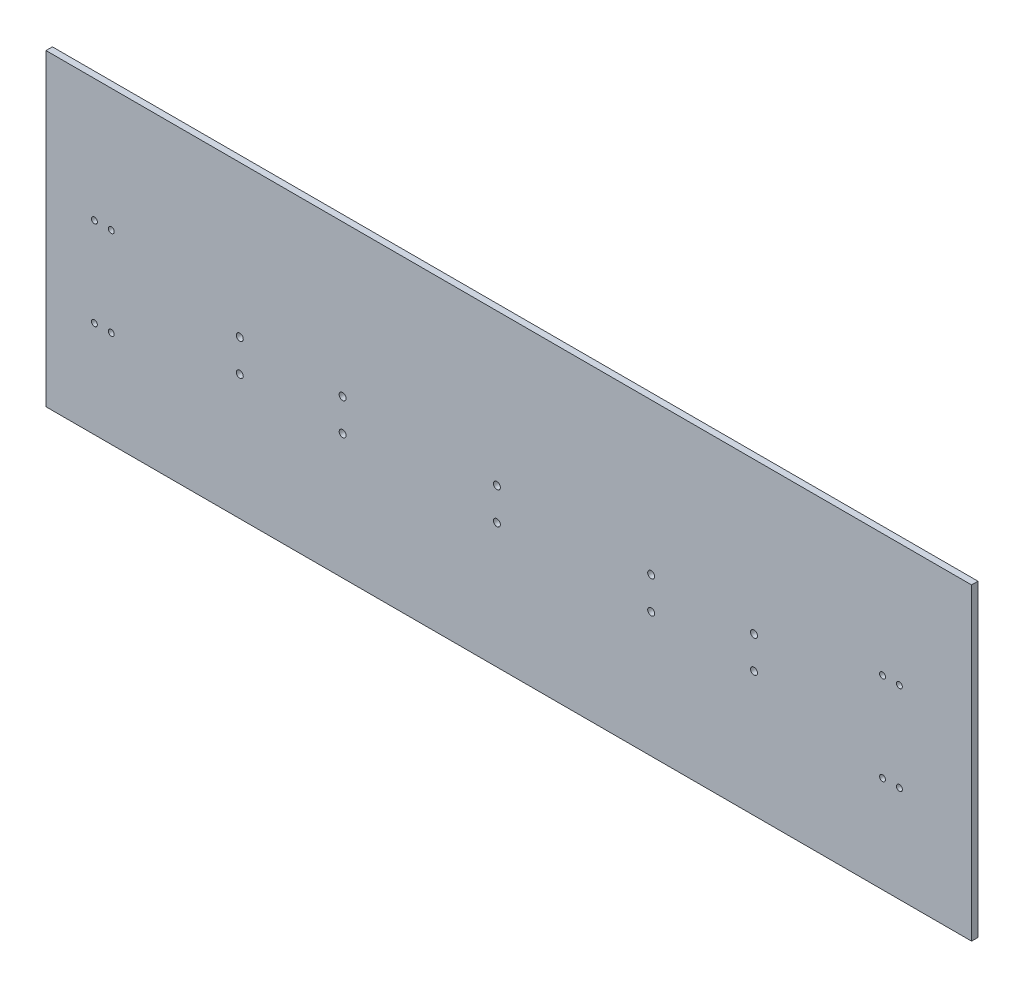
ISO-10303-21;
HEADER;
FILE_DESCRIPTION(('STEP AP214'),'2;1');
FILE_NAME('part.step','',(''),(''),'','','');
FILE_SCHEMA(('AUTOMOTIVE_DESIGN { 1 0 10303 214 1 1 1 1 }'));
ENDSEC;
DATA;
#1=APPLICATION_CONTEXT('core data for automotive mechanical design processes');
#2=APPLICATION_PROTOCOL_DEFINITION('international standard','automotive_design',2000,#1);
#3=PRODUCT_CONTEXT('',#1,'mechanical');
#4=PRODUCT('Part','Part','',(#3));
#5=PRODUCT_RELATED_PRODUCT_CATEGORY('part','',(#4));
#6=PRODUCT_DEFINITION_FORMATION('','',#4);
#7=PRODUCT_DEFINITION_CONTEXT('part definition',#1,'design');
#8=PRODUCT_DEFINITION('design','',#6,#7);
#9=PRODUCT_DEFINITION_SHAPE('','',#8);
#10=(LENGTH_UNIT() NAMED_UNIT(*) SI_UNIT(.MILLI.,.METRE.));
#11=(NAMED_UNIT(*) PLANE_ANGLE_UNIT() SI_UNIT($,.RADIAN.));
#12=(NAMED_UNIT(*) SI_UNIT($,.STERADIAN.) SOLID_ANGLE_UNIT());
#13=UNCERTAINTY_MEASURE_WITH_UNIT(LENGTH_MEASURE(1.E-05),#10,'distance_accuracy_value','');
#14=(GEOMETRIC_REPRESENTATION_CONTEXT(3) GLOBAL_UNCERTAINTY_ASSIGNED_CONTEXT((#13)) GLOBAL_UNIT_ASSIGNED_CONTEXT((#10,
#11,#12)) REPRESENTATION_CONTEXT('',''));
#15=CARTESIAN_POINT('',(0.,0.,0.));
#16=DIRECTION('',(0.,0.,1.));
#17=DIRECTION('',(1.,0.,0.));
#18=AXIS2_PLACEMENT_3D('',#15,#16,#17);
#19=CARTESIAN_POINT('',(0.,0.,6.35));
#20=DIRECTION('',(0.,0.,-1.));
#21=DIRECTION('',(-1.,0.,0.));
#22=AXIS2_PLACEMENT_3D('',#19,#20,#21);
#23=PLANE('',#22);
#24=DIRECTION('',(0.,-1.,0.));
#25=VECTOR('',#24,1.);
#26=CARTESIAN_POINT('',(0.,0.,6.35));
#27=LINE('',#26,#25);
#28=CARTESIAN_POINT('',(0.,304.8,6.35));
#29=VERTEX_POINT('',#28);
#30=CARTESIAN_POINT('',(0.,0.,6.35));
#31=VERTEX_POINT('',#30);
#32=EDGE_CURVE('E85',#29,#31,#27,.T.);
#33=ORIENTED_EDGE('',*,*,#32,.T.);
#34=DIRECTION('',(1.,0.,0.));
#35=VECTOR('',#34,1.);
#36=CARTESIAN_POINT('',(0.,0.,6.35));
#37=LINE('',#36,#35);
#38=CARTESIAN_POINT('',(914.4,0.,6.35));
#39=VERTEX_POINT('',#38);
#40=EDGE_CURVE('E80',#31,#39,#37,.T.);
#41=ORIENTED_EDGE('',*,*,#40,.T.);
#42=DIRECTION('',(0.,1.,0.));
#43=VECTOR('',#42,1.);
#44=CARTESIAN_POINT('',(914.4,0.,6.35));
#45=LINE('',#44,#43);
#46=CARTESIAN_POINT('',(914.4,304.8,6.35));
#47=VERTEX_POINT('',#46);
#48=EDGE_CURVE('E83',#39,#47,#45,.T.);
#49=ORIENTED_EDGE('',*,*,#48,.T.);
#50=DIRECTION('',(-1.,0.,0.));
#51=VECTOR('',#50,1.);
#52=CARTESIAN_POINT('',(0.,304.8,6.35));
#53=LINE('',#52,#51);
#54=EDGE_CURVE('E50',#47,#29,#53,.T.);
#55=ORIENTED_EDGE('',*,*,#54,.T.);
#56=EDGE_LOOP('',(#33,#41,#49,#55));
#57=FACE_BOUND('',#56,.T.);
#58=CARTESIAN_POINT('',(445.45395588462,155.343145214781,6.35));
#59=DIRECTION('',(0.,0.,1.));
#60=DIRECTION('',(1.,0.,0.));
#61=AXIS2_PLACEMENT_3D('',#58,#59,#60);
#62=CIRCLE('',#61,3.429);
#63=CARTESIAN_POINT('',(448.88295588462,155.343145214781,6.35));
#64=VERTEX_POINT('',#63);
#65=EDGE_CURVE('E100',#64,#64,#62,.T.);
#66=ORIENTED_EDGE('',*,*,#65,.F.);
#67=EDGE_LOOP('',(#66));
#68=FACE_BOUND('',#67,.T.);
#69=CARTESIAN_POINT('',(445.45395588462,123.593145214781,6.35));
#70=DIRECTION('',(0.,0.,1.));
#71=DIRECTION('',(1.,0.,0.));
#72=AXIS2_PLACEMENT_3D('',#69,#70,#71);
#73=CIRCLE('',#72,3.429);
#74=CARTESIAN_POINT('',(448.88295588462,123.593145214781,6.35));
#75=VERTEX_POINT('',#74);
#76=EDGE_CURVE('E115',#75,#75,#73,.T.);
#77=ORIENTED_EDGE('',*,*,#76,.F.);
#78=EDGE_LOOP('',(#77));
#79=FACE_BOUND('',#78,.T.);
#80=CARTESIAN_POINT('',(597.85395588462,155.343145214781,6.35));
#81=DIRECTION('',(0.,0.,1.));
#82=DIRECTION('',(1.,0.,0.));
#83=AXIS2_PLACEMENT_3D('',#80,#81,#82);
#84=CIRCLE('',#83,3.429);
#85=CARTESIAN_POINT('',(601.28295588462,155.343145214781,6.35));
#86=VERTEX_POINT('',#85);
#87=EDGE_CURVE('E121',#86,#86,#84,.T.);
#88=ORIENTED_EDGE('',*,*,#87,.F.);
#89=EDGE_LOOP('',(#88));
#90=FACE_BOUND('',#89,.T.);
#91=CARTESIAN_POINT('',(597.85395588462,123.593145214781,6.35));
#92=DIRECTION('',(0.,0.,1.));
#93=DIRECTION('',(1.,0.,0.));
#94=AXIS2_PLACEMENT_3D('',#91,#92,#93);
#95=CIRCLE('',#94,3.429);
#96=CARTESIAN_POINT('',(601.28295588462,123.593145214781,6.35));
#97=VERTEX_POINT('',#96);
#98=EDGE_CURVE('E127',#97,#97,#95,.T.);
#99=ORIENTED_EDGE('',*,*,#98,.F.);
#100=EDGE_LOOP('',(#99));
#101=FACE_BOUND('',#100,.T.);
#102=CARTESIAN_POINT('',(699.45395588462,155.343145214781,6.35));
#103=DIRECTION('',(0.,0.,1.));
#104=DIRECTION('',(1.,0.,0.));
#105=AXIS2_PLACEMENT_3D('',#102,#103,#104);
#106=CIRCLE('',#105,3.429);
#107=CARTESIAN_POINT('',(702.88295588462,155.343145214781,6.35));
#108=VERTEX_POINT('',#107);
#109=EDGE_CURVE('E133',#108,#108,#106,.T.);
#110=ORIENTED_EDGE('',*,*,#109,.F.);
#111=EDGE_LOOP('',(#110));
#112=FACE_BOUND('',#111,.T.);
#113=CARTESIAN_POINT('',(699.45395588462,123.593145214781,6.35));
#114=DIRECTION('',(0.,0.,1.));
#115=DIRECTION('',(1.,0.,0.));
#116=AXIS2_PLACEMENT_3D('',#113,#114,#115);
#117=CIRCLE('',#116,3.429);
#118=CARTESIAN_POINT('',(702.88295588462,123.593145214781,6.35));
#119=VERTEX_POINT('',#118);
#120=EDGE_CURVE('E139',#119,#119,#117,.T.);
#121=ORIENTED_EDGE('',*,*,#120,.F.);
#122=EDGE_LOOP('',(#121));
#123=FACE_BOUND('',#122,.T.);
#124=CARTESIAN_POINT('',(293.05395588462,155.343145214781,6.35));
#125=DIRECTION('',(0.,0.,1.));
#126=DIRECTION('',(1.,0.,0.));
#127=AXIS2_PLACEMENT_3D('',#124,#125,#126);
#128=CIRCLE('',#127,3.429);
#129=CARTESIAN_POINT('',(296.48295588462,155.343145214781,6.35));
#130=VERTEX_POINT('',#129);
#131=EDGE_CURVE('E145',#130,#130,#128,.T.);
#132=ORIENTED_EDGE('',*,*,#131,.F.);
#133=EDGE_LOOP('',(#132));
#134=FACE_BOUND('',#133,.T.);
#135=CARTESIAN_POINT('',(293.05395588462,123.593145214781,6.35));
#136=DIRECTION('',(0.,0.,1.));
#137=DIRECTION('',(1.,0.,0.));
#138=AXIS2_PLACEMENT_3D('',#135,#136,#137);
#139=CIRCLE('',#138,3.429);
#140=CARTESIAN_POINT('',(296.48295588462,123.593145214781,6.35));
#141=VERTEX_POINT('',#140);
#142=EDGE_CURVE('E151',#141,#141,#139,.T.);
#143=ORIENTED_EDGE('',*,*,#142,.F.);
#144=EDGE_LOOP('',(#143));
#145=FACE_BOUND('',#144,.T.);
#146=CARTESIAN_POINT('',(191.45395588462,155.343145214781,6.35));
#147=DIRECTION('',(0.,0.,1.));
#148=DIRECTION('',(1.,0.,0.));
#149=AXIS2_PLACEMENT_3D('',#146,#147,#148);
#150=CIRCLE('',#149,3.42900000000002);
#151=CARTESIAN_POINT('',(194.88295588462,155.343145214781,6.35));
#152=VERTEX_POINT('',#151);
#153=EDGE_CURVE('E157',#152,#152,#150,.T.);
#154=ORIENTED_EDGE('',*,*,#153,.F.);
#155=EDGE_LOOP('',(#154));
#156=FACE_BOUND('',#155,.T.);
#157=CARTESIAN_POINT('',(191.45395588462,123.593145214781,6.35));
#158=DIRECTION('',(0.,0.,1.));
#159=DIRECTION('',(1.,0.,0.));
#160=AXIS2_PLACEMENT_3D('',#157,#158,#159);
#161=CIRCLE('',#160,3.42900000000003);
#162=CARTESIAN_POINT('',(194.88295588462,123.593145214781,6.35));
#163=VERTEX_POINT('',#162);
#164=EDGE_CURVE('E163',#163,#163,#161,.T.);
#165=ORIENTED_EDGE('',*,*,#164,.F.);
#166=EDGE_LOOP('',(#165));
#167=FACE_BOUND('',#166,.T.);
#168=CARTESIAN_POINT('',(47.8169558846197,183.410145214781,6.35));
#169=DIRECTION('',(0.,0.,1.));
#170=DIRECTION('',(1.,0.,0.));
#171=AXIS2_PLACEMENT_3D('',#168,#169,#170);
#172=CIRCLE('',#171,2.921);
#173=CARTESIAN_POINT('',(50.7379558846197,183.410145214781,6.35));
#174=VERTEX_POINT('',#173);
#175=EDGE_CURVE('E169',#174,#174,#172,.T.);
#176=ORIENTED_EDGE('',*,*,#175,.F.);
#177=EDGE_LOOP('',(#176));
#178=FACE_BOUND('',#177,.T.);
#179=CARTESIAN_POINT('',(64.4539558846196,183.410145214781,6.35));
#180=DIRECTION('',(0.,0.,1.));
#181=DIRECTION('',(1.,0.,0.));
#182=AXIS2_PLACEMENT_3D('',#179,#180,#181);
#183=CIRCLE('',#182,2.92100000000001);
#184=CARTESIAN_POINT('',(67.3749558846197,183.410145214781,6.35));
#185=VERTEX_POINT('',#184);
#186=EDGE_CURVE('E175',#185,#185,#183,.T.);
#187=ORIENTED_EDGE('',*,*,#186,.F.);
#188=EDGE_LOOP('',(#187));
#189=FACE_BOUND('',#188,.T.);
#190=CARTESIAN_POINT('',(47.8169558846197,95.5261452147809,6.35));
#191=DIRECTION('',(0.,0.,1.));
#192=DIRECTION('',(1.,0.,0.));
#193=AXIS2_PLACEMENT_3D('',#190,#191,#192);
#194=CIRCLE('',#193,2.921);
#195=CARTESIAN_POINT('',(50.7379558846197,95.5261452147809,6.35));
#196=VERTEX_POINT('',#195);
#197=EDGE_CURVE('E181',#196,#196,#194,.T.);
#198=ORIENTED_EDGE('',*,*,#197,.F.);
#199=EDGE_LOOP('',(#198));
#200=FACE_BOUND('',#199,.T.);
#201=CARTESIAN_POINT('',(64.4539558846197,95.526145214781,6.35));
#202=DIRECTION('',(0.,0.,1.));
#203=DIRECTION('',(1.,0.,0.));
#204=AXIS2_PLACEMENT_3D('',#201,#202,#203);
#205=CIRCLE('',#204,2.92100000000001);
#206=CARTESIAN_POINT('',(67.3749558846197,95.526145214781,6.35));
#207=VERTEX_POINT('',#206);
#208=EDGE_CURVE('E187',#207,#207,#205,.T.);
#209=ORIENTED_EDGE('',*,*,#208,.F.);
#210=EDGE_LOOP('',(#209));
#211=FACE_BOUND('',#210,.T.);
#212=CARTESIAN_POINT('',(826.45395588462,183.410145214781,6.35));
#213=DIRECTION('',(0.,0.,1.));
#214=DIRECTION('',(1.,0.,0.));
#215=AXIS2_PLACEMENT_3D('',#212,#213,#214);
#216=CIRCLE('',#215,2.92099999999994);
#217=CARTESIAN_POINT('',(829.37495588462,183.410145214781,6.35));
#218=VERTEX_POINT('',#217);
#219=EDGE_CURVE('E193',#218,#218,#216,.T.);
#220=ORIENTED_EDGE('',*,*,#219,.F.);
#221=EDGE_LOOP('',(#220));
#222=FACE_BOUND('',#221,.T.);
#223=CARTESIAN_POINT('',(843.09095588462,183.410145214781,6.35));
#224=DIRECTION('',(0.,0.,1.));
#225=DIRECTION('',(1.,0.,0.));
#226=AXIS2_PLACEMENT_3D('',#223,#224,#225);
#227=CIRCLE('',#226,2.92099999999994);
#228=CARTESIAN_POINT('',(846.01195588462,183.410145214781,6.35));
#229=VERTEX_POINT('',#228);
#230=EDGE_CURVE('E199',#229,#229,#227,.T.);
#231=ORIENTED_EDGE('',*,*,#230,.F.);
#232=EDGE_LOOP('',(#231));
#233=FACE_BOUND('',#232,.T.);
#234=CARTESIAN_POINT('',(826.45395588462,95.526145214781,6.35));
#235=DIRECTION('',(0.,0.,1.));
#236=DIRECTION('',(1.,0.,0.));
#237=AXIS2_PLACEMENT_3D('',#234,#235,#236);
#238=CIRCLE('',#237,2.92099999999994);
#239=CARTESIAN_POINT('',(829.37495588462,95.526145214781,6.35));
#240=VERTEX_POINT('',#239);
#241=EDGE_CURVE('E205',#240,#240,#238,.T.);
#242=ORIENTED_EDGE('',*,*,#241,.F.);
#243=EDGE_LOOP('',(#242));
#244=FACE_BOUND('',#243,.T.);
#245=CARTESIAN_POINT('',(843.09095588462,95.526145214781,6.35));
#246=DIRECTION('',(0.,0.,1.));
#247=DIRECTION('',(1.,0.,0.));
#248=AXIS2_PLACEMENT_3D('',#245,#246,#247);
#249=CIRCLE('',#248,2.92099999999994);
#250=CARTESIAN_POINT('',(846.01195588462,95.526145214781,6.35));
#251=VERTEX_POINT('',#250);
#252=EDGE_CURVE('E211',#251,#251,#249,.T.);
#253=ORIENTED_EDGE('',*,*,#252,.F.);
#254=EDGE_LOOP('',(#253));
#255=FACE_BOUND('',#254,.T.);
#256=ADVANCED_FACE('F33',(#57,#68,#79,#90,#101,#112,#123,#134,#145,#156,#167,#178,#189,#200,
#211,#222,#233,#244,#255),#23,.F.);
#257=CARTESIAN_POINT('',(0.,0.,0.));
#258=DIRECTION('',(0.,0.,-1.));
#259=DIRECTION('',(-1.,0.,0.));
#260=AXIS2_PLACEMENT_3D('',#257,#258,#259);
#261=PLANE('',#260);
#262=CARTESIAN_POINT('',(826.45395588462,95.526145214781,0.));
#263=DIRECTION('',(0.,0.,1.));
#264=DIRECTION('',(1.,0.,0.));
#265=AXIS2_PLACEMENT_3D('',#262,#263,#264);
#266=CIRCLE('',#265,2.92099999999994);
#267=CARTESIAN_POINT('',(829.37495588462,95.526145214781,0.));
#268=VERTEX_POINT('',#267);
#269=EDGE_CURVE('E208',#268,#268,#266,.T.);
#270=ORIENTED_EDGE('',*,*,#269,.T.);
#271=EDGE_LOOP('',(#270));
#272=FACE_BOUND('',#271,.T.);
#273=CARTESIAN_POINT('',(826.45395588462,183.410145214781,0.));
#274=DIRECTION('',(0.,0.,1.));
#275=DIRECTION('',(1.,0.,0.));
#276=AXIS2_PLACEMENT_3D('',#273,#274,#275);
#277=CIRCLE('',#276,2.92099999999994);
#278=CARTESIAN_POINT('',(829.37495588462,183.410145214781,0.));
#279=VERTEX_POINT('',#278);
#280=EDGE_CURVE('E196',#279,#279,#277,.T.);
#281=ORIENTED_EDGE('',*,*,#280,.T.);
#282=EDGE_LOOP('',(#281));
#283=FACE_BOUND('',#282,.T.);
#284=CARTESIAN_POINT('',(47.8169558846197,95.5261452147809,0.));
#285=DIRECTION('',(0.,0.,1.));
#286=DIRECTION('',(1.,0.,0.));
#287=AXIS2_PLACEMENT_3D('',#284,#285,#286);
#288=CIRCLE('',#287,2.921);
#289=CARTESIAN_POINT('',(50.7379558846197,95.5261452147809,0.));
#290=VERTEX_POINT('',#289);
#291=EDGE_CURVE('E184',#290,#290,#288,.T.);
#292=ORIENTED_EDGE('',*,*,#291,.T.);
#293=EDGE_LOOP('',(#292));
#294=FACE_BOUND('',#293,.T.);
#295=CARTESIAN_POINT('',(47.8169558846197,183.410145214781,0.));
#296=DIRECTION('',(0.,0.,1.));
#297=DIRECTION('',(1.,0.,0.));
#298=AXIS2_PLACEMENT_3D('',#295,#296,#297);
#299=CIRCLE('',#298,2.921);
#300=CARTESIAN_POINT('',(50.7379558846197,183.410145214781,0.));
#301=VERTEX_POINT('',#300);
#302=EDGE_CURVE('E172',#301,#301,#299,.T.);
#303=ORIENTED_EDGE('',*,*,#302,.T.);
#304=EDGE_LOOP('',(#303));
#305=FACE_BOUND('',#304,.T.);
#306=CARTESIAN_POINT('',(191.45395588462,155.343145214781,0.));
#307=DIRECTION('',(0.,0.,1.));
#308=DIRECTION('',(1.,0.,0.));
#309=AXIS2_PLACEMENT_3D('',#306,#307,#308);
#310=CIRCLE('',#309,3.42900000000002);
#311=CARTESIAN_POINT('',(194.88295588462,155.343145214781,0.));
#312=VERTEX_POINT('',#311);
#313=EDGE_CURVE('E160',#312,#312,#310,.T.);
#314=ORIENTED_EDGE('',*,*,#313,.T.);
#315=EDGE_LOOP('',(#314));
#316=FACE_BOUND('',#315,.T.);
#317=CARTESIAN_POINT('',(293.05395588462,155.343145214781,0.));
#318=DIRECTION('',(0.,0.,1.));
#319=DIRECTION('',(1.,0.,0.));
#320=AXIS2_PLACEMENT_3D('',#317,#318,#319);
#321=CIRCLE('',#320,3.429);
#322=CARTESIAN_POINT('',(296.48295588462,155.343145214781,0.));
#323=VERTEX_POINT('',#322);
#324=EDGE_CURVE('E148',#323,#323,#321,.T.);
#325=ORIENTED_EDGE('',*,*,#324,.T.);
#326=EDGE_LOOP('',(#325));
#327=FACE_BOUND('',#326,.T.);
#328=CARTESIAN_POINT('',(699.45395588462,155.343145214781,0.));
#329=DIRECTION('',(0.,0.,1.));
#330=DIRECTION('',(1.,0.,0.));
#331=AXIS2_PLACEMENT_3D('',#328,#329,#330);
#332=CIRCLE('',#331,3.429);
#333=CARTESIAN_POINT('',(702.88295588462,155.343145214781,0.));
#334=VERTEX_POINT('',#333);
#335=EDGE_CURVE('E136',#334,#334,#332,.T.);
#336=ORIENTED_EDGE('',*,*,#335,.T.);
#337=EDGE_LOOP('',(#336));
#338=FACE_BOUND('',#337,.T.);
#339=CARTESIAN_POINT('',(597.85395588462,155.343145214781,0.));
#340=DIRECTION('',(0.,0.,1.));
#341=DIRECTION('',(1.,0.,0.));
#342=AXIS2_PLACEMENT_3D('',#339,#340,#341);
#343=CIRCLE('',#342,3.429);
#344=CARTESIAN_POINT('',(601.28295588462,155.343145214781,0.));
#345=VERTEX_POINT('',#344);
#346=EDGE_CURVE('E124',#345,#345,#343,.T.);
#347=ORIENTED_EDGE('',*,*,#346,.T.);
#348=EDGE_LOOP('',(#347));
#349=FACE_BOUND('',#348,.T.);
#350=CARTESIAN_POINT('',(445.45395588462,155.343145214781,0.));
#351=DIRECTION('',(0.,0.,1.));
#352=DIRECTION('',(1.,0.,0.));
#353=AXIS2_PLACEMENT_3D('',#350,#351,#352);
#354=CIRCLE('',#353,3.429);
#355=CARTESIAN_POINT('',(448.88295588462,155.343145214781,0.));
#356=VERTEX_POINT('',#355);
#357=EDGE_CURVE('E112',#356,#356,#354,.T.);
#358=ORIENTED_EDGE('',*,*,#357,.T.);
#359=EDGE_LOOP('',(#358));
#360=FACE_BOUND('',#359,.T.);
#361=DIRECTION('',(0.,-1.,0.));
#362=VECTOR('',#361,1.);
#363=CARTESIAN_POINT('',(0.,0.,0.));
#364=LINE('',#363,#362);
#365=CARTESIAN_POINT('',(0.,304.8,0.));
#366=VERTEX_POINT('',#365);
#367=CARTESIAN_POINT('',(0.,0.,0.));
#368=VERTEX_POINT('',#367);
#369=EDGE_CURVE('E97',#366,#368,#364,.T.);
#370=ORIENTED_EDGE('',*,*,#369,.F.);
#371=DIRECTION('',(-1.,0.,0.));
#372=VECTOR('',#371,1.);
#373=CARTESIAN_POINT('',(0.,304.8,0.));
#374=LINE('',#373,#372);
#375=CARTESIAN_POINT('',(914.4,304.8,0.));
#376=VERTEX_POINT('',#375);
#377=EDGE_CURVE('E73',#376,#366,#374,.T.);
#378=ORIENTED_EDGE('',*,*,#377,.F.);
#379=DIRECTION('',(0.,1.,0.));
#380=VECTOR('',#379,1.);
#381=CARTESIAN_POINT('',(914.4,0.,0.));
#382=LINE('',#381,#380);
#383=CARTESIAN_POINT('',(914.4,0.,0.));
#384=VERTEX_POINT('',#383);
#385=EDGE_CURVE('E67',#384,#376,#382,.T.);
#386=ORIENTED_EDGE('',*,*,#385,.F.);
#387=DIRECTION('',(1.,0.,0.));
#388=VECTOR('',#387,1.);
#389=CARTESIAN_POINT('',(0.,0.,0.));
#390=LINE('',#389,#388);
#391=EDGE_CURVE('E89',#368,#384,#390,.T.);
#392=ORIENTED_EDGE('',*,*,#391,.F.);
#393=EDGE_LOOP('',(#370,#378,#386,#392));
#394=FACE_BOUND('',#393,.T.);
#395=CARTESIAN_POINT('',(445.45395588462,123.593145214781,0.));
#396=DIRECTION('',(0.,0.,1.));
#397=DIRECTION('',(1.,0.,0.));
#398=AXIS2_PLACEMENT_3D('',#395,#396,#397);
#399=CIRCLE('',#398,3.429);
#400=CARTESIAN_POINT('',(448.88295588462,123.593145214781,0.));
#401=VERTEX_POINT('',#400);
#402=EDGE_CURVE('E118',#401,#401,#399,.T.);
#403=ORIENTED_EDGE('',*,*,#402,.T.);
#404=EDGE_LOOP('',(#403));
#405=FACE_BOUND('',#404,.T.);
#406=CARTESIAN_POINT('',(597.85395588462,123.593145214781,0.));
#407=DIRECTION('',(0.,0.,1.));
#408=DIRECTION('',(1.,0.,0.));
#409=AXIS2_PLACEMENT_3D('',#406,#407,#408);
#410=CIRCLE('',#409,3.429);
#411=CARTESIAN_POINT('',(601.28295588462,123.593145214781,0.));
#412=VERTEX_POINT('',#411);
#413=EDGE_CURVE('E130',#412,#412,#410,.T.);
#414=ORIENTED_EDGE('',*,*,#413,.T.);
#415=EDGE_LOOP('',(#414));
#416=FACE_BOUND('',#415,.T.);
#417=CARTESIAN_POINT('',(699.45395588462,123.593145214781,0.));
#418=DIRECTION('',(0.,0.,1.));
#419=DIRECTION('',(1.,0.,0.));
#420=AXIS2_PLACEMENT_3D('',#417,#418,#419);
#421=CIRCLE('',#420,3.429);
#422=CARTESIAN_POINT('',(702.88295588462,123.593145214781,0.));
#423=VERTEX_POINT('',#422);
#424=EDGE_CURVE('E142',#423,#423,#421,.T.);
#425=ORIENTED_EDGE('',*,*,#424,.T.);
#426=EDGE_LOOP('',(#425));
#427=FACE_BOUND('',#426,.T.);
#428=CARTESIAN_POINT('',(293.05395588462,123.593145214781,0.));
#429=DIRECTION('',(0.,0.,1.));
#430=DIRECTION('',(1.,0.,0.));
#431=AXIS2_PLACEMENT_3D('',#428,#429,#430);
#432=CIRCLE('',#431,3.429);
#433=CARTESIAN_POINT('',(296.48295588462,123.593145214781,0.));
#434=VERTEX_POINT('',#433);
#435=EDGE_CURVE('E154',#434,#434,#432,.T.);
#436=ORIENTED_EDGE('',*,*,#435,.T.);
#437=EDGE_LOOP('',(#436));
#438=FACE_BOUND('',#437,.T.);
#439=CARTESIAN_POINT('',(191.45395588462,123.593145214781,0.));
#440=DIRECTION('',(0.,0.,1.));
#441=DIRECTION('',(1.,0.,0.));
#442=AXIS2_PLACEMENT_3D('',#439,#440,#441);
#443=CIRCLE('',#442,3.42900000000003);
#444=CARTESIAN_POINT('',(194.88295588462,123.593145214781,0.));
#445=VERTEX_POINT('',#444);
#446=EDGE_CURVE('E166',#445,#445,#443,.T.);
#447=ORIENTED_EDGE('',*,*,#446,.T.);
#448=EDGE_LOOP('',(#447));
#449=FACE_BOUND('',#448,.T.);
#450=CARTESIAN_POINT('',(64.4539558846196,183.410145214781,0.));
#451=DIRECTION('',(0.,0.,1.));
#452=DIRECTION('',(1.,0.,0.));
#453=AXIS2_PLACEMENT_3D('',#450,#451,#452);
#454=CIRCLE('',#453,2.92100000000001);
#455=CARTESIAN_POINT('',(67.3749558846197,183.410145214781,0.));
#456=VERTEX_POINT('',#455);
#457=EDGE_CURVE('E178',#456,#456,#454,.T.);
#458=ORIENTED_EDGE('',*,*,#457,.T.);
#459=EDGE_LOOP('',(#458));
#460=FACE_BOUND('',#459,.T.);
#461=CARTESIAN_POINT('',(64.4539558846197,95.526145214781,0.));
#462=DIRECTION('',(0.,0.,1.));
#463=DIRECTION('',(1.,0.,0.));
#464=AXIS2_PLACEMENT_3D('',#461,#462,#463);
#465=CIRCLE('',#464,2.92100000000001);
#466=CARTESIAN_POINT('',(67.3749558846197,95.526145214781,0.));
#467=VERTEX_POINT('',#466);
#468=EDGE_CURVE('E190',#467,#467,#465,.T.);
#469=ORIENTED_EDGE('',*,*,#468,.T.);
#470=EDGE_LOOP('',(#469));
#471=FACE_BOUND('',#470,.T.);
#472=CARTESIAN_POINT('',(843.09095588462,183.410145214781,0.));
#473=DIRECTION('',(0.,0.,1.));
#474=DIRECTION('',(1.,0.,0.));
#475=AXIS2_PLACEMENT_3D('',#472,#473,#474);
#476=CIRCLE('',#475,2.92099999999994);
#477=CARTESIAN_POINT('',(846.01195588462,183.410145214781,0.));
#478=VERTEX_POINT('',#477);
#479=EDGE_CURVE('E202',#478,#478,#476,.T.);
#480=ORIENTED_EDGE('',*,*,#479,.T.);
#481=EDGE_LOOP('',(#480));
#482=FACE_BOUND('',#481,.T.);
#483=CARTESIAN_POINT('',(843.09095588462,95.526145214781,0.));
#484=DIRECTION('',(0.,0.,1.));
#485=DIRECTION('',(1.,0.,0.));
#486=AXIS2_PLACEMENT_3D('',#483,#484,#485);
#487=CIRCLE('',#486,2.92099999999994);
#488=CARTESIAN_POINT('',(846.01195588462,95.526145214781,0.));
#489=VERTEX_POINT('',#488);
#490=EDGE_CURVE('E214',#489,#489,#487,.T.);
#491=ORIENTED_EDGE('',*,*,#490,.T.);
#492=EDGE_LOOP('',(#491));
#493=FACE_BOUND('',#492,.T.);
#494=ADVANCED_FACE('F108',(#272,#283,#294,#305,#316,#327,#338,#349,#360,#394,#405,#416,#427,
#438,#449,#460,#471,#482,#493),#261,.T.);
#495=CARTESIAN_POINT('',(0.,0.,6.35));
#496=DIRECTION('',(1.,0.,0.));
#497=DIRECTION('',(0.,0.,-1.));
#498=AXIS2_PLACEMENT_3D('',#495,#496,#497);
#499=PLANE('',#498);
#500=ORIENTED_EDGE('',*,*,#369,.T.);
#501=DIRECTION('',(0.,0.,-1.));
#502=VECTOR('',#501,1.);
#503=CARTESIAN_POINT('',(0.,0.,6.35));
#504=LINE('',#503,#502);
#505=EDGE_CURVE('E11',#31,#368,#504,.T.);
#506=ORIENTED_EDGE('',*,*,#505,.F.);
#507=ORIENTED_EDGE('',*,*,#32,.F.);
#508=DIRECTION('',(0.,0.,-1.));
#509=VECTOR('',#508,1.);
#510=CARTESIAN_POINT('',(0.,304.8,6.35));
#511=LINE('',#510,#509);
#512=EDGE_CURVE('E93',#29,#366,#511,.T.);
#513=ORIENTED_EDGE('',*,*,#512,.T.);
#514=EDGE_LOOP('',(#500,#506,#507,#513));
#515=FACE_BOUND('',#514,.T.);
#516=ADVANCED_FACE('F35',(#515),#499,.F.);
#517=CARTESIAN_POINT('',(0.,0.,6.35));
#518=DIRECTION('',(0.,1.,0.));
#519=DIRECTION('',(0.,0.,1.));
#520=AXIS2_PLACEMENT_3D('',#517,#518,#519);
#521=PLANE('',#520);
#522=ORIENTED_EDGE('',*,*,#391,.T.);
#523=DIRECTION('',(0.,0.,-1.));
#524=VECTOR('',#523,1.);
#525=CARTESIAN_POINT('',(914.4,0.,6.35));
#526=LINE('',#525,#524);
#527=EDGE_CURVE('E42',#39,#384,#526,.T.);
#528=ORIENTED_EDGE('',*,*,#527,.F.);
#529=ORIENTED_EDGE('',*,*,#40,.F.);
#530=ORIENTED_EDGE('',*,*,#505,.T.);
#531=EDGE_LOOP('',(#522,#528,#529,#530));
#532=FACE_BOUND('',#531,.T.);
#533=ADVANCED_FACE('F88',(#532),#521,.F.);
#534=CARTESIAN_POINT('',(914.4,0.,6.35));
#535=DIRECTION('',(-1.,0.,0.));
#536=DIRECTION('',(0.,0.,1.));
#537=AXIS2_PLACEMENT_3D('',#534,#535,#536);
#538=PLANE('',#537);
#539=ORIENTED_EDGE('',*,*,#385,.T.);
#540=DIRECTION('',(0.,0.,-1.));
#541=VECTOR('',#540,1.);
#542=CARTESIAN_POINT('',(914.4,304.8,6.35));
#543=LINE('',#542,#541);
#544=EDGE_CURVE('E90',#47,#376,#543,.T.);
#545=ORIENTED_EDGE('',*,*,#544,.F.);
#546=ORIENTED_EDGE('',*,*,#48,.F.);
#547=ORIENTED_EDGE('',*,*,#527,.T.);
#548=EDGE_LOOP('',(#539,#545,#546,#547));
#549=FACE_BOUND('',#548,.T.);
#550=ADVANCED_FACE('F91',(#549),#538,.F.);
#551=CARTESIAN_POINT('',(0.,304.8,6.35));
#552=DIRECTION('',(0.,-1.,0.));
#553=DIRECTION('',(0.,0.,-1.));
#554=AXIS2_PLACEMENT_3D('',#551,#552,#553);
#555=PLANE('',#554);
#556=ORIENTED_EDGE('',*,*,#377,.T.);
#557=ORIENTED_EDGE('',*,*,#512,.F.);
#558=ORIENTED_EDGE('',*,*,#54,.F.);
#559=ORIENTED_EDGE('',*,*,#544,.T.);
#560=EDGE_LOOP('',(#556,#557,#558,#559));
#561=FACE_BOUND('',#560,.T.);
#562=ADVANCED_FACE('F105',(#561),#555,.F.);
#563=CARTESIAN_POINT('',(445.45395588462,155.343145214781,6.35));
#564=DIRECTION('',(0.,0.,-1.));
#565=DIRECTION('',(-1.,0.,0.));
#566=AXIS2_PLACEMENT_3D('',#563,#564,#565);
#567=CYLINDRICAL_SURFACE('',#566,3.429);
#568=ORIENTED_EDGE('',*,*,#65,.T.);
#569=EDGE_LOOP('',(#568));
#570=FACE_BOUND('',#569,.T.);
#571=ORIENTED_EDGE('',*,*,#357,.F.);
#572=EDGE_LOOP('',(#571));
#573=FACE_BOUND('',#572,.T.);
#574=ADVANCED_FACE('F231',(#570,#573),#567,.F.);
#575=CARTESIAN_POINT('',(445.45395588462,123.593145214781,6.35));
#576=DIRECTION('',(0.,0.,-1.));
#577=DIRECTION('',(-1.,0.,0.));
#578=AXIS2_PLACEMENT_3D('',#575,#576,#577);
#579=CYLINDRICAL_SURFACE('',#578,3.429);
#580=ORIENTED_EDGE('',*,*,#76,.T.);
#581=EDGE_LOOP('',(#580));
#582=FACE_BOUND('',#581,.T.);
#583=ORIENTED_EDGE('',*,*,#402,.F.);
#584=EDGE_LOOP('',(#583));
#585=FACE_BOUND('',#584,.T.);
#586=ADVANCED_FACE('F277',(#582,#585),#579,.F.);
#587=CARTESIAN_POINT('',(597.85395588462,155.343145214781,6.35));
#588=DIRECTION('',(0.,0.,-1.));
#589=DIRECTION('',(-1.,0.,0.));
#590=AXIS2_PLACEMENT_3D('',#587,#588,#589);
#591=CYLINDRICAL_SURFACE('',#590,3.429);
#592=ORIENTED_EDGE('',*,*,#87,.T.);
#593=EDGE_LOOP('',(#592));
#594=FACE_BOUND('',#593,.T.);
#595=ORIENTED_EDGE('',*,*,#346,.F.);
#596=EDGE_LOOP('',(#595));
#597=FACE_BOUND('',#596,.T.);
#598=ADVANCED_FACE('F285',(#594,#597),#591,.F.);
#599=CARTESIAN_POINT('',(597.85395588462,123.593145214781,6.35));
#600=DIRECTION('',(0.,0.,-1.));
#601=DIRECTION('',(-1.,0.,0.));
#602=AXIS2_PLACEMENT_3D('',#599,#600,#601);
#603=CYLINDRICAL_SURFACE('',#602,3.429);
#604=ORIENTED_EDGE('',*,*,#98,.T.);
#605=EDGE_LOOP('',(#604));
#606=FACE_BOUND('',#605,.T.);
#607=ORIENTED_EDGE('',*,*,#413,.F.);
#608=EDGE_LOOP('',(#607));
#609=FACE_BOUND('',#608,.T.);
#610=ADVANCED_FACE('F293',(#606,#609),#603,.F.);
#611=CARTESIAN_POINT('',(699.45395588462,155.343145214781,6.35));
#612=DIRECTION('',(0.,0.,-1.));
#613=DIRECTION('',(-1.,0.,0.));
#614=AXIS2_PLACEMENT_3D('',#611,#612,#613);
#615=CYLINDRICAL_SURFACE('',#614,3.429);
#616=ORIENTED_EDGE('',*,*,#109,.T.);
#617=EDGE_LOOP('',(#616));
#618=FACE_BOUND('',#617,.T.);
#619=ORIENTED_EDGE('',*,*,#335,.F.);
#620=EDGE_LOOP('',(#619));
#621=FACE_BOUND('',#620,.T.);
#622=ADVANCED_FACE('F302',(#618,#621),#615,.F.);
#623=CARTESIAN_POINT('',(699.45395588462,123.593145214781,6.35));
#624=DIRECTION('',(0.,0.,-1.));
#625=DIRECTION('',(-1.,0.,0.));
#626=AXIS2_PLACEMENT_3D('',#623,#624,#625);
#627=CYLINDRICAL_SURFACE('',#626,3.429);
#628=ORIENTED_EDGE('',*,*,#120,.T.);
#629=EDGE_LOOP('',(#628));
#630=FACE_BOUND('',#629,.T.);
#631=ORIENTED_EDGE('',*,*,#424,.F.);
#632=EDGE_LOOP('',(#631));
#633=FACE_BOUND('',#632,.T.);
#634=ADVANCED_FACE('F311',(#630,#633),#627,.F.);
#635=CARTESIAN_POINT('',(293.05395588462,155.343145214781,6.35));
#636=DIRECTION('',(0.,0.,-1.));
#637=DIRECTION('',(-1.,0.,0.));
#638=AXIS2_PLACEMENT_3D('',#635,#636,#637);
#639=CYLINDRICAL_SURFACE('',#638,3.429);
#640=ORIENTED_EDGE('',*,*,#131,.T.);
#641=EDGE_LOOP('',(#640));
#642=FACE_BOUND('',#641,.T.);
#643=ORIENTED_EDGE('',*,*,#324,.F.);
#644=EDGE_LOOP('',(#643));
#645=FACE_BOUND('',#644,.T.);
#646=ADVANCED_FACE('F320',(#642,#645),#639,.F.);
#647=CARTESIAN_POINT('',(293.05395588462,123.593145214781,6.35));
#648=DIRECTION('',(0.,0.,-1.));
#649=DIRECTION('',(-1.,0.,0.));
#650=AXIS2_PLACEMENT_3D('',#647,#648,#649);
#651=CYLINDRICAL_SURFACE('',#650,3.429);
#652=ORIENTED_EDGE('',*,*,#142,.T.);
#653=EDGE_LOOP('',(#652));
#654=FACE_BOUND('',#653,.T.);
#655=ORIENTED_EDGE('',*,*,#435,.F.);
#656=EDGE_LOOP('',(#655));
#657=FACE_BOUND('',#656,.T.);
#658=ADVANCED_FACE('F329',(#654,#657),#651,.F.);
#659=CARTESIAN_POINT('',(191.45395588462,155.343145214781,6.35));
#660=DIRECTION('',(0.,0.,-1.));
#661=DIRECTION('',(-1.,0.,0.));
#662=AXIS2_PLACEMENT_3D('',#659,#660,#661);
#663=CYLINDRICAL_SURFACE('',#662,3.42900000000002);
#664=ORIENTED_EDGE('',*,*,#153,.T.);
#665=EDGE_LOOP('',(#664));
#666=FACE_BOUND('',#665,.T.);
#667=ORIENTED_EDGE('',*,*,#313,.F.);
#668=EDGE_LOOP('',(#667));
#669=FACE_BOUND('',#668,.T.);
#670=ADVANCED_FACE('F338',(#666,#669),#663,.F.);
#671=CARTESIAN_POINT('',(191.45395588462,123.593145214781,6.35));
#672=DIRECTION('',(0.,0.,-1.));
#673=DIRECTION('',(-1.,0.,0.));
#674=AXIS2_PLACEMENT_3D('',#671,#672,#673);
#675=CYLINDRICAL_SURFACE('',#674,3.42900000000003);
#676=ORIENTED_EDGE('',*,*,#164,.T.);
#677=EDGE_LOOP('',(#676));
#678=FACE_BOUND('',#677,.T.);
#679=ORIENTED_EDGE('',*,*,#446,.F.);
#680=EDGE_LOOP('',(#679));
#681=FACE_BOUND('',#680,.T.);
#682=ADVANCED_FACE('F347',(#678,#681),#675,.F.);
#683=CARTESIAN_POINT('',(47.8169558846197,183.410145214781,6.35));
#684=DIRECTION('',(0.,0.,-1.));
#685=DIRECTION('',(-1.,0.,0.));
#686=AXIS2_PLACEMENT_3D('',#683,#684,#685);
#687=CYLINDRICAL_SURFACE('',#686,2.921);
#688=ORIENTED_EDGE('',*,*,#175,.T.);
#689=EDGE_LOOP('',(#688));
#690=FACE_BOUND('',#689,.T.);
#691=ORIENTED_EDGE('',*,*,#302,.F.);
#692=EDGE_LOOP('',(#691));
#693=FACE_BOUND('',#692,.T.);
#694=ADVANCED_FACE('F356',(#690,#693),#687,.F.);
#695=CARTESIAN_POINT('',(64.4539558846196,183.410145214781,6.35));
#696=DIRECTION('',(0.,0.,-1.));
#697=DIRECTION('',(-1.,0.,0.));
#698=AXIS2_PLACEMENT_3D('',#695,#696,#697);
#699=CYLINDRICAL_SURFACE('',#698,2.92100000000001);
#700=ORIENTED_EDGE('',*,*,#186,.T.);
#701=EDGE_LOOP('',(#700));
#702=FACE_BOUND('',#701,.T.);
#703=ORIENTED_EDGE('',*,*,#457,.F.);
#704=EDGE_LOOP('',(#703));
#705=FACE_BOUND('',#704,.T.);
#706=ADVANCED_FACE('F365',(#702,#705),#699,.F.);
#707=CARTESIAN_POINT('',(47.8169558846197,95.5261452147809,6.35));
#708=DIRECTION('',(0.,0.,-1.));
#709=DIRECTION('',(-1.,0.,0.));
#710=AXIS2_PLACEMENT_3D('',#707,#708,#709);
#711=CYLINDRICAL_SURFACE('',#710,2.921);
#712=ORIENTED_EDGE('',*,*,#197,.T.);
#713=EDGE_LOOP('',(#712));
#714=FACE_BOUND('',#713,.T.);
#715=ORIENTED_EDGE('',*,*,#291,.F.);
#716=EDGE_LOOP('',(#715));
#717=FACE_BOUND('',#716,.T.);
#718=ADVANCED_FACE('F374',(#714,#717),#711,.F.);
#719=CARTESIAN_POINT('',(64.4539558846197,95.526145214781,6.35));
#720=DIRECTION('',(0.,0.,-1.));
#721=DIRECTION('',(-1.,0.,0.));
#722=AXIS2_PLACEMENT_3D('',#719,#720,#721);
#723=CYLINDRICAL_SURFACE('',#722,2.92100000000001);
#724=ORIENTED_EDGE('',*,*,#208,.T.);
#725=EDGE_LOOP('',(#724));
#726=FACE_BOUND('',#725,.T.);
#727=ORIENTED_EDGE('',*,*,#468,.F.);
#728=EDGE_LOOP('',(#727));
#729=FACE_BOUND('',#728,.T.);
#730=ADVANCED_FACE('F383',(#726,#729),#723,.F.);
#731=CARTESIAN_POINT('',(826.45395588462,183.410145214781,6.35));
#732=DIRECTION('',(0.,0.,-1.));
#733=DIRECTION('',(-1.,0.,0.));
#734=AXIS2_PLACEMENT_3D('',#731,#732,#733);
#735=CYLINDRICAL_SURFACE('',#734,2.92099999999994);
#736=ORIENTED_EDGE('',*,*,#219,.T.);
#737=EDGE_LOOP('',(#736));
#738=FACE_BOUND('',#737,.T.);
#739=ORIENTED_EDGE('',*,*,#280,.F.);
#740=EDGE_LOOP('',(#739));
#741=FACE_BOUND('',#740,.T.);
#742=ADVANCED_FACE('F392',(#738,#741),#735,.F.);
#743=CARTESIAN_POINT('',(843.09095588462,183.410145214781,6.35));
#744=DIRECTION('',(0.,0.,-1.));
#745=DIRECTION('',(-1.,0.,0.));
#746=AXIS2_PLACEMENT_3D('',#743,#744,#745);
#747=CYLINDRICAL_SURFACE('',#746,2.92099999999994);
#748=ORIENTED_EDGE('',*,*,#230,.T.);
#749=EDGE_LOOP('',(#748));
#750=FACE_BOUND('',#749,.T.);
#751=ORIENTED_EDGE('',*,*,#479,.F.);
#752=EDGE_LOOP('',(#751));
#753=FACE_BOUND('',#752,.T.);
#754=ADVANCED_FACE('F401',(#750,#753),#747,.F.);
#755=CARTESIAN_POINT('',(826.45395588462,95.526145214781,6.35));
#756=DIRECTION('',(0.,0.,-1.));
#757=DIRECTION('',(-1.,0.,0.));
#758=AXIS2_PLACEMENT_3D('',#755,#756,#757);
#759=CYLINDRICAL_SURFACE('',#758,2.92099999999994);
#760=ORIENTED_EDGE('',*,*,#241,.T.);
#761=EDGE_LOOP('',(#760));
#762=FACE_BOUND('',#761,.T.);
#763=ORIENTED_EDGE('',*,*,#269,.F.);
#764=EDGE_LOOP('',(#763));
#765=FACE_BOUND('',#764,.T.);
#766=ADVANCED_FACE('F410',(#762,#765),#759,.F.);
#767=CARTESIAN_POINT('',(843.09095588462,95.526145214781,6.35));
#768=DIRECTION('',(0.,0.,-1.));
#769=DIRECTION('',(-1.,0.,0.));
#770=AXIS2_PLACEMENT_3D('',#767,#768,#769);
#771=CYLINDRICAL_SURFACE('',#770,2.92099999999994);
#772=ORIENTED_EDGE('',*,*,#252,.T.);
#773=EDGE_LOOP('',(#772));
#774=FACE_BOUND('',#773,.T.);
#775=ORIENTED_EDGE('',*,*,#490,.F.);
#776=EDGE_LOOP('',(#775));
#777=FACE_BOUND('',#776,.T.);
#778=ADVANCED_FACE('F220',(#774,#777),#771,.F.);
#779=CLOSED_SHELL('',(#256,#494,#516,#533,#550,#562,#574,#586,#598,#610,#622,#634,#646,#658,
#670,#682,#694,#706,#718,#730,#742,#754,#766,#778));
#780=MANIFOLD_SOLID_BREP('B2',#779);
#781=ADVANCED_BREP_SHAPE_REPRESENTATION('',(#18,#780),#14);
#782=SHAPE_DEFINITION_REPRESENTATION(#9,#781);
ENDSEC;
END-ISO-10303-21;
